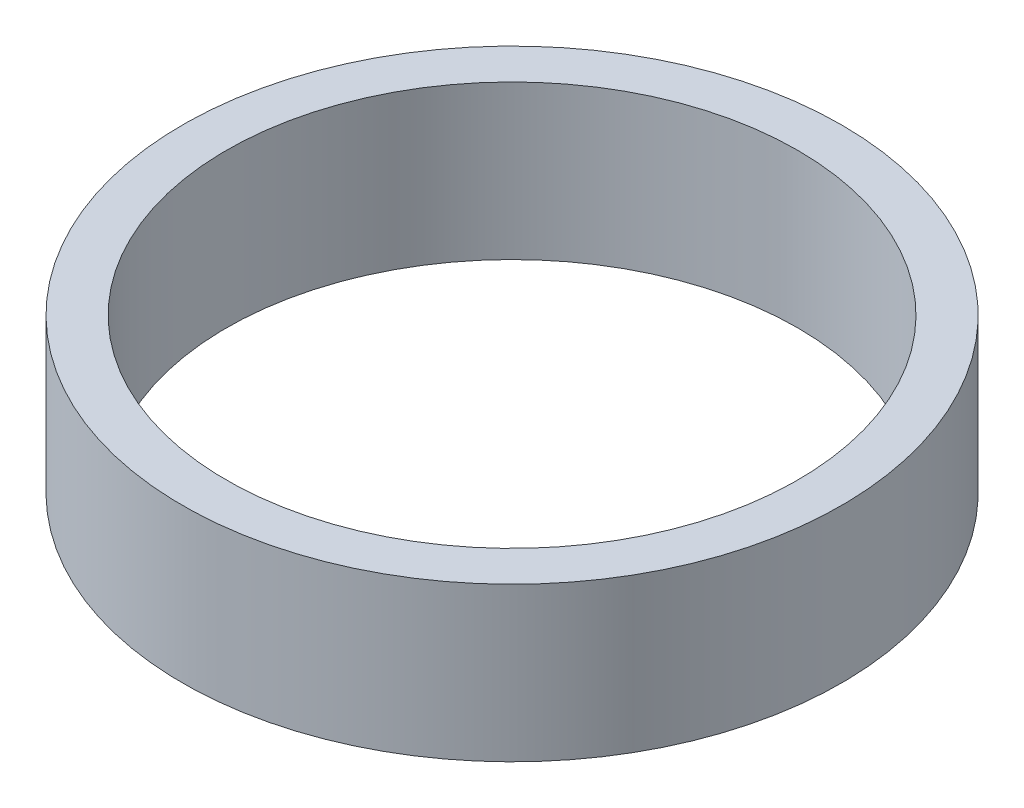
ISO-10303-21;
HEADER;
FILE_DESCRIPTION(('STEP AP214'),'2;1');
FILE_NAME('part.step','',(''),(''),'','','');
FILE_SCHEMA(('AUTOMOTIVE_DESIGN { 1 0 10303 214 1 1 1 1 }'));
ENDSEC;
DATA;
#1=APPLICATION_CONTEXT('core data for automotive mechanical design processes');
#2=APPLICATION_PROTOCOL_DEFINITION('international standard','automotive_design',2000,#1);
#3=PRODUCT_CONTEXT('',#1,'mechanical');
#4=PRODUCT('Part','Part','',(#3));
#5=PRODUCT_RELATED_PRODUCT_CATEGORY('part','',(#4));
#6=PRODUCT_DEFINITION_FORMATION('','',#4);
#7=PRODUCT_DEFINITION_CONTEXT('part definition',#1,'design');
#8=PRODUCT_DEFINITION('design','',#6,#7);
#9=PRODUCT_DEFINITION_SHAPE('','',#8);
#10=(LENGTH_UNIT() NAMED_UNIT(*) SI_UNIT(.MILLI.,.METRE.));
#11=(NAMED_UNIT(*) PLANE_ANGLE_UNIT() SI_UNIT($,.RADIAN.));
#12=(NAMED_UNIT(*) SI_UNIT($,.STERADIAN.) SOLID_ANGLE_UNIT());
#13=UNCERTAINTY_MEASURE_WITH_UNIT(LENGTH_MEASURE(1.E-05),#10,'distance_accuracy_value','');
#14=(GEOMETRIC_REPRESENTATION_CONTEXT(3) GLOBAL_UNCERTAINTY_ASSIGNED_CONTEXT((#13)) GLOBAL_UNIT_ASSIGNED_CONTEXT((#10,
#11,#12)) REPRESENTATION_CONTEXT('',''));
#15=CARTESIAN_POINT('',(0.,0.,0.));
#16=DIRECTION('',(0.,0.,1.));
#17=DIRECTION('',(1.,0.,0.));
#18=AXIS2_PLACEMENT_3D('',#15,#16,#17);
#19=CARTESIAN_POINT('',(0.,0.,0.));
#20=DIRECTION('',(0.,-1.,0.));
#21=DIRECTION('',(0.,0.,-1.));
#22=AXIS2_PLACEMENT_3D('',#19,#20,#21);
#23=CYLINDRICAL_SURFACE('',#22,7.5);
#24=CARTESIAN_POINT('',(0.,3.5,0.));
#25=DIRECTION('',(0.,-1.,0.));
#26=DIRECTION('',(0.,0.,-1.));
#27=AXIS2_PLACEMENT_3D('',#24,#25,#26);
#28=CIRCLE('',#27,7.5);
#29=CARTESIAN_POINT('',(0.,3.5,-7.5));
#30=VERTEX_POINT('',#29);
#31=EDGE_CURVE('E10',#30,#30,#28,.T.);
#32=ORIENTED_EDGE('',*,*,#31,.T.);
#33=EDGE_LOOP('',(#32));
#34=FACE_BOUND('',#33,.T.);
#35=CARTESIAN_POINT('',(0.,0.,0.));
#36=DIRECTION('',(0.,-1.,0.));
#37=DIRECTION('',(0.,0.,-1.));
#38=AXIS2_PLACEMENT_3D('',#35,#36,#37);
#39=CIRCLE('',#38,7.5);
#40=CARTESIAN_POINT('',(0.,0.,-7.5));
#41=VERTEX_POINT('',#40);
#42=EDGE_CURVE('E46',#41,#41,#39,.T.);
#43=ORIENTED_EDGE('',*,*,#42,.F.);
#44=EDGE_LOOP('',(#43));
#45=FACE_BOUND('',#44,.T.);
#46=ADVANCED_FACE('F32',(#34,#45),#23,.T.);
#47=CARTESIAN_POINT('',(7.5,3.5,0.));
#48=DIRECTION('',(0.,1.,0.));
#49=DIRECTION('',(0.,0.,1.));
#50=AXIS2_PLACEMENT_3D('',#47,#48,#49);
#51=PLANE('',#50);
#52=CARTESIAN_POINT('',(0.,3.5,0.));
#53=DIRECTION('',(0.,-1.,0.));
#54=DIRECTION('',(0.,0.,-1.));
#55=AXIS2_PLACEMENT_3D('',#52,#53,#54);
#56=CIRCLE('',#55,6.5);
#57=CARTESIAN_POINT('',(0.,3.5,-6.5));
#58=VERTEX_POINT('',#57);
#59=EDGE_CURVE('E38',#58,#58,#56,.T.);
#60=ORIENTED_EDGE('',*,*,#59,.T.);
#61=EDGE_LOOP('',(#60));
#62=FACE_BOUND('',#61,.T.);
#63=ORIENTED_EDGE('',*,*,#31,.F.);
#64=EDGE_LOOP('',(#63));
#65=FACE_BOUND('',#64,.T.);
#66=ADVANCED_FACE('F56',(#62,#65),#51,.T.);
#67=CARTESIAN_POINT('',(0.,0.,0.));
#68=DIRECTION('',(0.,-1.,0.));
#69=DIRECTION('',(0.,0.,-1.));
#70=AXIS2_PLACEMENT_3D('',#67,#68,#69);
#71=CYLINDRICAL_SURFACE('',#70,6.5);
#72=CARTESIAN_POINT('',(0.,0.,0.));
#73=DIRECTION('',(0.,-1.,0.));
#74=DIRECTION('',(0.,0.,-1.));
#75=AXIS2_PLACEMENT_3D('',#72,#73,#74);
#76=CIRCLE('',#75,6.5);
#77=CARTESIAN_POINT('',(0.,0.,-6.5));
#78=VERTEX_POINT('',#77);
#79=EDGE_CURVE('E42',#78,#78,#76,.T.);
#80=ORIENTED_EDGE('',*,*,#79,.T.);
#81=EDGE_LOOP('',(#80));
#82=FACE_BOUND('',#81,.T.);
#83=ORIENTED_EDGE('',*,*,#59,.F.);
#84=EDGE_LOOP('',(#83));
#85=FACE_BOUND('',#84,.T.);
#86=ADVANCED_FACE('F60',(#82,#85),#71,.F.);
#87=CARTESIAN_POINT('',(6.5,0.,0.));
#88=DIRECTION('',(0.,-1.,0.));
#89=DIRECTION('',(0.,0.,-1.));
#90=AXIS2_PLACEMENT_3D('',#87,#88,#89);
#91=PLANE('',#90);
#92=ORIENTED_EDGE('',*,*,#42,.T.);
#93=EDGE_LOOP('',(#92));
#94=FACE_BOUND('',#93,.T.);
#95=ORIENTED_EDGE('',*,*,#79,.F.);
#96=EDGE_LOOP('',(#95));
#97=FACE_BOUND('',#96,.T.);
#98=ADVANCED_FACE('F52',(#94,#97),#91,.T.);
#99=CLOSED_SHELL('',(#46,#66,#86,#98));
#100=MANIFOLD_SOLID_BREP('B2',#99);
#101=ADVANCED_BREP_SHAPE_REPRESENTATION('',(#18,#100),#14);
#102=SHAPE_DEFINITION_REPRESENTATION(#9,#101);
ENDSEC;
END-ISO-10303-21;
